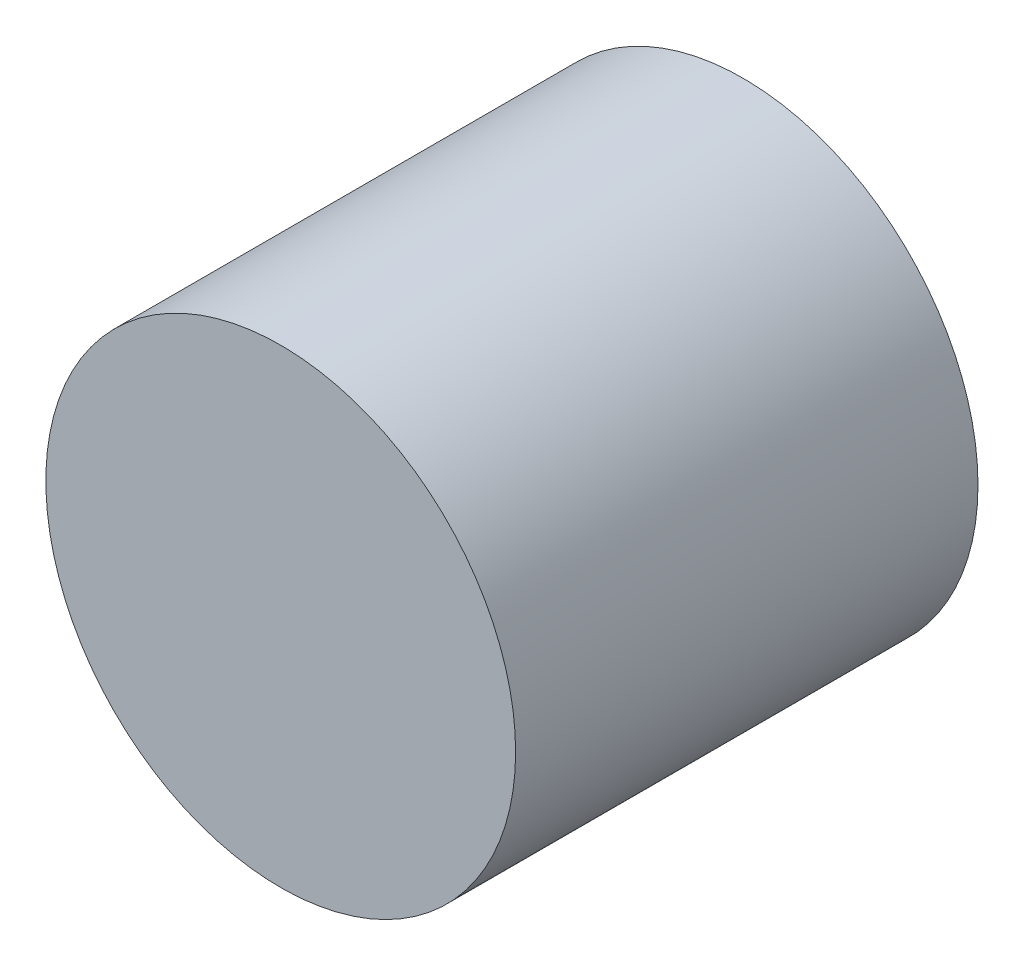
ISO-10303-21;
HEADER;
FILE_DESCRIPTION(('STEP AP214'),'2;1');
FILE_NAME('part.step','',(''),(''),'','','');
FILE_SCHEMA(('AUTOMOTIVE_DESIGN { 1 0 10303 214 1 1 1 1 }'));
ENDSEC;
DATA;
#1=APPLICATION_CONTEXT('core data for automotive mechanical design processes');
#2=APPLICATION_PROTOCOL_DEFINITION('international standard','automotive_design',2000,#1);
#3=PRODUCT_CONTEXT('',#1,'mechanical');
#4=PRODUCT('Part','Part','',(#3));
#5=PRODUCT_RELATED_PRODUCT_CATEGORY('part','',(#4));
#6=PRODUCT_DEFINITION_FORMATION('','',#4);
#7=PRODUCT_DEFINITION_CONTEXT('part definition',#1,'design');
#8=PRODUCT_DEFINITION('design','',#6,#7);
#9=PRODUCT_DEFINITION_SHAPE('','',#8);
#10=(LENGTH_UNIT() NAMED_UNIT(*) SI_UNIT(.MILLI.,.METRE.));
#11=(NAMED_UNIT(*) PLANE_ANGLE_UNIT() SI_UNIT($,.RADIAN.));
#12=(NAMED_UNIT(*) SI_UNIT($,.STERADIAN.) SOLID_ANGLE_UNIT());
#13=UNCERTAINTY_MEASURE_WITH_UNIT(LENGTH_MEASURE(1.E-05),#10,'distance_accuracy_value','');
#14=(GEOMETRIC_REPRESENTATION_CONTEXT(3) GLOBAL_UNCERTAINTY_ASSIGNED_CONTEXT((#13)) GLOBAL_UNIT_ASSIGNED_CONTEXT((#10,
#11,#12)) REPRESENTATION_CONTEXT('',''));
#15=CARTESIAN_POINT('',(0.,0.,0.));
#16=DIRECTION('',(0.,0.,1.));
#17=DIRECTION('',(1.,0.,0.));
#18=AXIS2_PLACEMENT_3D('',#15,#16,#17);
#19=CARTESIAN_POINT('',(0.,0.,50.));
#20=DIRECTION('',(0.,0.,-1.));
#21=DIRECTION('',(-1.,0.,0.));
#22=AXIS2_PLACEMENT_3D('',#19,#20,#21);
#23=CYLINDRICAL_SURFACE('',#22,25.4);
#24=CARTESIAN_POINT('',(0.,0.,50.));
#25=DIRECTION('',(0.,0.,1.));
#26=DIRECTION('',(1.,0.,0.));
#27=AXIS2_PLACEMENT_3D('',#24,#25,#26);
#28=CIRCLE('',#27,25.4);
#29=CARTESIAN_POINT('',(25.4,0.,50.));
#30=VERTEX_POINT('',#29);
#31=EDGE_CURVE('E10',#30,#30,#28,.T.);
#32=ORIENTED_EDGE('',*,*,#31,.F.);
#33=EDGE_LOOP('',(#32));
#34=FACE_BOUND('',#33,.T.);
#35=CARTESIAN_POINT('',(0.,0.,0.));
#36=DIRECTION('',(0.,0.,1.));
#37=DIRECTION('',(1.,0.,0.));
#38=AXIS2_PLACEMENT_3D('',#35,#36,#37);
#39=CIRCLE('',#38,25.4);
#40=CARTESIAN_POINT('',(25.4,0.,0.));
#41=VERTEX_POINT('',#40);
#42=EDGE_CURVE('E33',#41,#41,#39,.T.);
#43=ORIENTED_EDGE('',*,*,#42,.T.);
#44=EDGE_LOOP('',(#43));
#45=FACE_BOUND('',#44,.T.);
#46=ADVANCED_FACE('F30',(#34,#45),#23,.T.);
#47=CARTESIAN_POINT('',(0.,0.,50.));
#48=DIRECTION('',(0.,0.,1.));
#49=DIRECTION('',(1.,0.,0.));
#50=AXIS2_PLACEMENT_3D('',#47,#48,#49);
#51=PLANE('',#50);
#52=ORIENTED_EDGE('',*,*,#31,.T.);
#53=EDGE_LOOP('',(#52));
#54=FACE_BOUND('',#53,.T.);
#55=ADVANCED_FACE('F45',(#54),#51,.T.);
#56=CARTESIAN_POINT('',(0.,0.,0.));
#57=DIRECTION('',(0.,0.,1.));
#58=DIRECTION('',(1.,0.,0.));
#59=AXIS2_PLACEMENT_3D('',#56,#57,#58);
#60=PLANE('',#59);
#61=ORIENTED_EDGE('',*,*,#42,.F.);
#62=EDGE_LOOP('',(#61));
#63=FACE_BOUND('',#62,.T.);
#64=ADVANCED_FACE('F43',(#63),#60,.F.);
#65=CLOSED_SHELL('',(#46,#55,#64));
#66=MANIFOLD_SOLID_BREP('B2',#65);
#67=ADVANCED_BREP_SHAPE_REPRESENTATION('',(#18,#66),#14);
#68=SHAPE_DEFINITION_REPRESENTATION(#9,#67);
ENDSEC;
END-ISO-10303-21;
